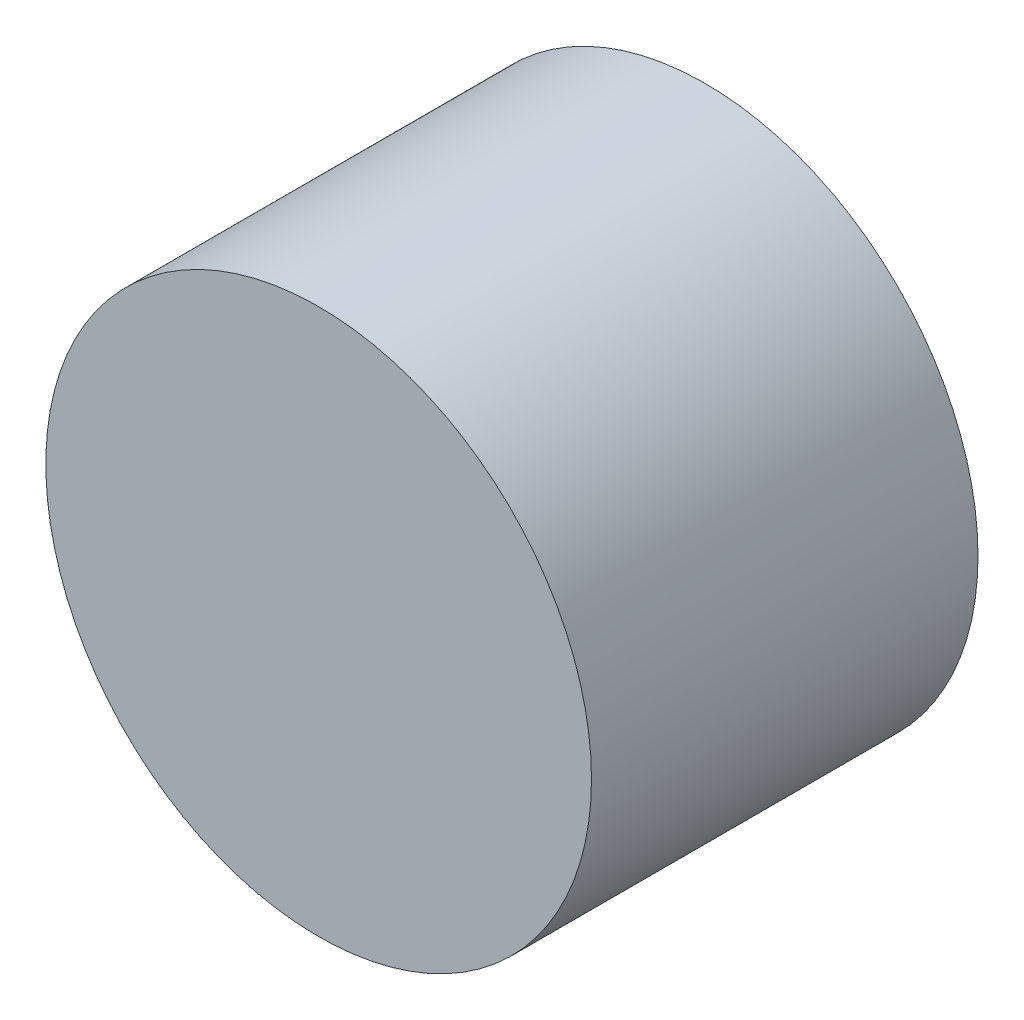
ISO-10303-21;
HEADER;
FILE_DESCRIPTION(('STEP AP214'),'2;1');
FILE_NAME('part.step','',(''),(''),'','','');
FILE_SCHEMA(('AUTOMOTIVE_DESIGN { 1 0 10303 214 1 1 1 1 }'));
ENDSEC;
DATA;
#1=APPLICATION_CONTEXT('core data for automotive mechanical design processes');
#2=APPLICATION_PROTOCOL_DEFINITION('international standard','automotive_design',2000,#1);
#3=PRODUCT_CONTEXT('',#1,'mechanical');
#4=PRODUCT('Part','Part','',(#3));
#5=PRODUCT_RELATED_PRODUCT_CATEGORY('part','',(#4));
#6=PRODUCT_DEFINITION_FORMATION('','',#4);
#7=PRODUCT_DEFINITION_CONTEXT('part definition',#1,'design');
#8=PRODUCT_DEFINITION('design','',#6,#7);
#9=PRODUCT_DEFINITION_SHAPE('','',#8);
#10=(LENGTH_UNIT() NAMED_UNIT(*) SI_UNIT(.MILLI.,.METRE.));
#11=(NAMED_UNIT(*) PLANE_ANGLE_UNIT() SI_UNIT($,.RADIAN.));
#12=(NAMED_UNIT(*) SI_UNIT($,.STERADIAN.) SOLID_ANGLE_UNIT());
#13=UNCERTAINTY_MEASURE_WITH_UNIT(LENGTH_MEASURE(1.E-05),#10,'distance_accuracy_value','');
#14=(GEOMETRIC_REPRESENTATION_CONTEXT(3) GLOBAL_UNCERTAINTY_ASSIGNED_CONTEXT((#13)) GLOBAL_UNIT_ASSIGNED_CONTEXT((#10,
#11,#12)) REPRESENTATION_CONTEXT('',''));
#15=CARTESIAN_POINT('',(0.,0.,0.));
#16=DIRECTION('',(0.,0.,1.));
#17=DIRECTION('',(1.,0.,0.));
#18=AXIS2_PLACEMENT_3D('',#15,#16,#17);
#19=CARTESIAN_POINT('',(0.,0.,0.));
#20=DIRECTION('',(0.,0.,1.));
#21=DIRECTION('',(1.,0.,0.));
#22=AXIS2_PLACEMENT_3D('',#19,#20,#21);
#23=PLANE('',#22);
#24=CARTESIAN_POINT('',(-2.29,0.,0.));
#25=DIRECTION('',(0.,0.,1.));
#26=DIRECTION('',(1.,0.,0.));
#27=AXIS2_PLACEMENT_3D('',#24,#25,#26);
#28=CIRCLE('',#27,0.5);
#29=CARTESIAN_POINT('',(-1.79,0.,0.));
#30=VERTEX_POINT('',#29);
#31=EDGE_CURVE('E52',#30,#30,#28,.T.);
#32=ORIENTED_EDGE('',*,*,#31,.T.);
#33=EDGE_LOOP('',(#32));
#34=FACE_BOUND('',#33,.T.);
#35=CARTESIAN_POINT('',(0.,0.,0.));
#36=DIRECTION('',(0.,0.,1.));
#37=DIRECTION('',(1.,0.,0.));
#38=AXIS2_PLACEMENT_3D('',#35,#36,#37);
#39=CIRCLE('',#38,6.);
#40=CARTESIAN_POINT('',(6.,0.,0.));
#41=VERTEX_POINT('',#40);
#42=EDGE_CURVE('E42',#41,#41,#39,.T.);
#43=ORIENTED_EDGE('',*,*,#42,.F.);
#44=EDGE_LOOP('',(#43));
#45=FACE_BOUND('',#44,.T.);
#46=CARTESIAN_POINT('',(2.29,0.,0.));
#47=DIRECTION('',(0.,0.,1.));
#48=DIRECTION('',(1.,0.,0.));
#49=AXIS2_PLACEMENT_3D('',#46,#47,#48);
#50=CIRCLE('',#49,0.5);
#51=CARTESIAN_POINT('',(2.79,0.,0.));
#52=VERTEX_POINT('',#51);
#53=EDGE_CURVE('E10',#52,#52,#50,.F.);
#54=ORIENTED_EDGE('',*,*,#53,.F.);
#55=EDGE_LOOP('',(#54));
#56=FACE_BOUND('',#55,.T.);
#57=ADVANCED_FACE('F31',(#34,#45,#56),#23,.F.);
#58=CARTESIAN_POINT('',(0.,0.,8.5));
#59=DIRECTION('',(0.,0.,-1.));
#60=DIRECTION('',(-1.,0.,0.));
#61=AXIS2_PLACEMENT_3D('',#58,#59,#60);
#62=CYLINDRICAL_SURFACE('',#61,6.);
#63=CARTESIAN_POINT('',(0.,0.,8.5));
#64=DIRECTION('',(0.,0.,1.));
#65=DIRECTION('',(1.,0.,0.));
#66=AXIS2_PLACEMENT_3D('',#63,#64,#65);
#67=CIRCLE('',#66,6.);
#68=CARTESIAN_POINT('',(6.,0.,8.5));
#69=VERTEX_POINT('',#68);
#70=EDGE_CURVE('E38',#69,#69,#67,.T.);
#71=ORIENTED_EDGE('',*,*,#70,.F.);
#72=EDGE_LOOP('',(#71));
#73=FACE_BOUND('',#72,.T.);
#74=ORIENTED_EDGE('',*,*,#42,.T.);
#75=EDGE_LOOP('',(#74));
#76=FACE_BOUND('',#75,.T.);
#77=ADVANCED_FACE('F33',(#73,#76),#62,.T.);
#78=CARTESIAN_POINT('',(0.,0.,8.5));
#79=DIRECTION('',(0.,0.,1.));
#80=DIRECTION('',(1.,0.,0.));
#81=AXIS2_PLACEMENT_3D('',#78,#79,#80);
#82=PLANE('',#81);
#83=ORIENTED_EDGE('',*,*,#70,.T.);
#84=EDGE_LOOP('',(#83));
#85=FACE_BOUND('',#84,.T.);
#86=ADVANCED_FACE('F74',(#85),#82,.T.);
#87=CARTESIAN_POINT('',(2.29,0.,-1.7));
#88=DIRECTION('',(0.,0.,1.));
#89=DIRECTION('',(1.,0.,0.));
#90=AXIS2_PLACEMENT_3D('',#87,#88,#89);
#91=CYLINDRICAL_SURFACE('',#90,0.5);
#92=CARTESIAN_POINT('',(2.29,0.,-1.7));
#93=DIRECTION('',(0.,0.,-1.));
#94=DIRECTION('',(-1.,0.,0.));
#95=AXIS2_PLACEMENT_3D('',#92,#93,#94);
#96=CIRCLE('',#95,0.5);
#97=CARTESIAN_POINT('',(1.79,0.,-1.7));
#98=VERTEX_POINT('',#97);
#99=EDGE_CURVE('E47',#98,#98,#96,.T.);
#100=ORIENTED_EDGE('',*,*,#99,.F.);
#101=EDGE_LOOP('',(#100));
#102=FACE_BOUND('',#101,.T.);
#103=ORIENTED_EDGE('',*,*,#53,.T.);
#104=EDGE_LOOP('',(#103));
#105=FACE_BOUND('',#104,.T.);
#106=ADVANCED_FACE('F80',(#102,#105),#91,.T.);
#107=CARTESIAN_POINT('',(2.29,0.,-1.7));
#108=DIRECTION('',(0.,0.,-1.));
#109=DIRECTION('',(-1.,0.,0.));
#110=AXIS2_PLACEMENT_3D('',#107,#108,#109);
#111=PLANE('',#110);
#112=ORIENTED_EDGE('',*,*,#99,.T.);
#113=EDGE_LOOP('',(#112));
#114=FACE_BOUND('',#113,.T.);
#115=ADVANCED_FACE('F67',(#114),#111,.T.);
#116=CARTESIAN_POINT('',(-2.29,0.,-1.7));
#117=DIRECTION('',(0.,0.,1.));
#118=DIRECTION('',(1.,0.,0.));
#119=AXIS2_PLACEMENT_3D('',#116,#117,#118);
#120=CYLINDRICAL_SURFACE('',#119,0.5);
#121=CARTESIAN_POINT('',(-2.29,0.,-1.7));
#122=DIRECTION('',(0.,0.,1.));
#123=DIRECTION('',(1.,0.,0.));
#124=AXIS2_PLACEMENT_3D('',#121,#122,#123);
#125=CIRCLE('',#124,0.5);
#126=CARTESIAN_POINT('',(-1.79,0.,-1.7));
#127=VERTEX_POINT('',#126);
#128=EDGE_CURVE('E51',#127,#127,#125,.T.);
#129=ORIENTED_EDGE('',*,*,#128,.T.);
#130=EDGE_LOOP('',(#129));
#131=FACE_BOUND('',#130,.T.);
#132=ORIENTED_EDGE('',*,*,#31,.F.);
#133=EDGE_LOOP('',(#132));
#134=FACE_BOUND('',#133,.T.);
#135=ADVANCED_FACE('F58',(#131,#134),#120,.T.);
#136=CARTESIAN_POINT('',(-2.29,0.,-1.7));
#137=DIRECTION('',(0.,0.,-1.));
#138=DIRECTION('',(1.,0.,0.));
#139=AXIS2_PLACEMENT_3D('',#136,#137,#138);
#140=PLANE('',#139);
#141=ORIENTED_EDGE('',*,*,#128,.F.);
#142=EDGE_LOOP('',(#141));
#143=FACE_BOUND('',#142,.T.);
#144=ADVANCED_FACE('F61',(#143),#140,.T.);
#145=CLOSED_SHELL('',(#57,#77,#86,#106,#115,#135,#144));
#146=MANIFOLD_SOLID_BREP('B2',#145);
#147=ADVANCED_BREP_SHAPE_REPRESENTATION('',(#18,#146),#14);
#148=SHAPE_DEFINITION_REPRESENTATION(#9,#147);
ENDSEC;
END-ISO-10303-21;
